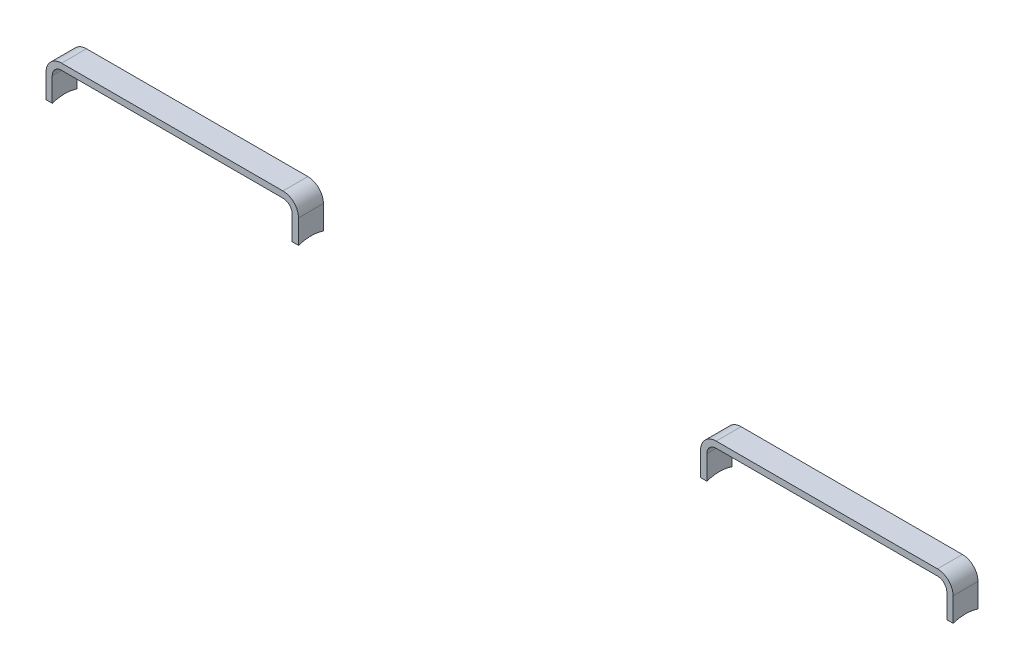
ISO-10303-21;
HEADER;
FILE_DESCRIPTION(('STEP AP214'),'2;1');
FILE_NAME('part.step','',(''),(''),'','','');
FILE_SCHEMA(('AUTOMOTIVE_DESIGN { 1 0 10303 214 1 1 1 1 }'));
ENDSEC;
DATA;
#1=APPLICATION_CONTEXT('core data for automotive mechanical design processes');
#2=APPLICATION_PROTOCOL_DEFINITION('international standard','automotive_design',2000,#1);
#3=PRODUCT_CONTEXT('',#1,'mechanical');
#4=PRODUCT('Part','Part','',(#3));
#5=PRODUCT_RELATED_PRODUCT_CATEGORY('part','',(#4));
#6=PRODUCT_DEFINITION_FORMATION('','',#4);
#7=PRODUCT_DEFINITION_CONTEXT('part definition',#1,'design');
#8=PRODUCT_DEFINITION('design','',#6,#7);
#9=PRODUCT_DEFINITION_SHAPE('','',#8);
#10=(LENGTH_UNIT() NAMED_UNIT(*) SI_UNIT(.MILLI.,.METRE.));
#11=(NAMED_UNIT(*) PLANE_ANGLE_UNIT() SI_UNIT($,.RADIAN.));
#12=(NAMED_UNIT(*) SI_UNIT($,.STERADIAN.) SOLID_ANGLE_UNIT());
#13=UNCERTAINTY_MEASURE_WITH_UNIT(LENGTH_MEASURE(1.E-05),#10,'distance_accuracy_value','');
#14=(GEOMETRIC_REPRESENTATION_CONTEXT(3) GLOBAL_UNCERTAINTY_ASSIGNED_CONTEXT((#13)) GLOBAL_UNIT_ASSIGNED_CONTEXT((#10,
#11,#12)) REPRESENTATION_CONTEXT('',''));
#15=CARTESIAN_POINT('',(0.,0.,0.));
#16=DIRECTION('',(0.,0.,1.));
#17=DIRECTION('',(1.,0.,0.));
#18=AXIS2_PLACEMENT_3D('',#15,#16,#17);
#19=CARTESIAN_POINT('',(140.5,649.700004626427,-1580.));
#20=DIRECTION('',(0.,0.,1.));
#21=DIRECTION('',(0.,-1.,0.));
#22=AXIS2_PLACEMENT_3D('',#19,#20,#21);
#23=CYLINDRICAL_SURFACE('',#22,5.);
#24=CARTESIAN_POINT('',(140.5,649.700004626427,-1576.));
#25=DIRECTION('',(0.,0.,-1.));
#26=DIRECTION('',(-1.,0.,0.));
#27=AXIS2_PLACEMENT_3D('',#24,#25,#26);
#28=CIRCLE('',#27,5.);
#29=CARTESIAN_POINT('',(140.5,654.700004626427,-1576.));
#30=VERTEX_POINT('',#29);
#31=CARTESIAN_POINT('',(145.5,649.700004626427,-1576.));
#32=VERTEX_POINT('',#31);
#33=EDGE_CURVE('E330',#30,#32,#28,.T.);
#34=ORIENTED_EDGE('',*,*,#33,.T.);
#35=DIRECTION('',(0.,0.,1.));
#36=VECTOR('',#35,1.);
#37=CARTESIAN_POINT('',(145.5,649.700004626427,-1580.));
#38=LINE('',#37,#36);
#39=CARTESIAN_POINT('',(145.5,649.700004626427,-1584.));
#40=VERTEX_POINT('',#39);
#41=EDGE_CURVE('E335',#40,#32,#38,.T.);
#42=ORIENTED_EDGE('',*,*,#41,.F.);
#43=CARTESIAN_POINT('',(140.5,649.700004626427,-1584.));
#44=DIRECTION('',(0.,0.,-1.));
#45=DIRECTION('',(-1.,0.,0.));
#46=AXIS2_PLACEMENT_3D('',#43,#44,#45);
#47=CIRCLE('',#46,5.);
#48=CARTESIAN_POINT('',(140.5,654.700004626427,-1584.));
#49=VERTEX_POINT('',#48);
#50=EDGE_CURVE('E275',#49,#40,#47,.T.);
#51=ORIENTED_EDGE('',*,*,#50,.F.);
#52=DIRECTION('',(0.,0.,1.));
#53=VECTOR('',#52,1.);
#54=CARTESIAN_POINT('',(140.5,654.700004626427,-1580.));
#55=LINE('',#54,#53);
#56=EDGE_CURVE('E272',#49,#30,#55,.T.);
#57=ORIENTED_EDGE('',*,*,#56,.T.);
#58=EDGE_LOOP('',(#34,#42,#51,#57));
#59=FACE_BOUND('',#58,.T.);
#60=ADVANCED_FACE('F142',(#59),#23,.T.);
#61=CARTESIAN_POINT('',(140.5,654.700004626427,-1580.));
#62=DIRECTION('',(0.,-1.,0.));
#63=DIRECTION('',(0.,0.,-1.));
#64=AXIS2_PLACEMENT_3D('',#61,#62,#63);
#65=PLANE('',#64);
#66=DIRECTION('',(-1.,0.,0.));
#67=VECTOR('',#66,1.);
#68=CARTESIAN_POINT('',(140.5,654.700004626427,-1576.));
#69=LINE('',#68,#67);
#70=CARTESIAN_POINT('',(69.5000000000004,654.700004626427,-1576.));
#71=VERTEX_POINT('',#70);
#72=EDGE_CURVE('E323',#30,#71,#69,.T.);
#73=ORIENTED_EDGE('',*,*,#72,.F.);
#74=ORIENTED_EDGE('',*,*,#56,.F.);
#75=DIRECTION('',(-1.,0.,0.));
#76=VECTOR('',#75,1.);
#77=CARTESIAN_POINT('',(140.5,654.700004626427,-1584.));
#78=LINE('',#77,#76);
#79=CARTESIAN_POINT('',(69.5000000000004,654.700004626427,-1584.));
#80=VERTEX_POINT('',#79);
#81=EDGE_CURVE('E268',#49,#80,#78,.T.);
#82=ORIENTED_EDGE('',*,*,#81,.T.);
#83=DIRECTION('',(0.,0.,1.));
#84=VECTOR('',#83,1.);
#85=CARTESIAN_POINT('',(69.5000000000004,654.700004626427,-1580.));
#86=LINE('',#85,#84);
#87=EDGE_CURVE('E271',#80,#71,#86,.T.);
#88=ORIENTED_EDGE('',*,*,#87,.T.);
#89=EDGE_LOOP('',(#73,#74,#82,#88));
#90=FACE_BOUND('',#89,.T.);
#91=ADVANCED_FACE('F388',(#90),#65,.F.);
#92=CARTESIAN_POINT('',(69.5000000000004,649.700004626427,-1580.));
#93=DIRECTION('',(0.,0.,1.));
#94=DIRECTION('',(0.,-1.,0.));
#95=AXIS2_PLACEMENT_3D('',#92,#93,#94);
#96=CYLINDRICAL_SURFACE('',#95,5.);
#97=CARTESIAN_POINT('',(69.5000000000004,649.700004626427,-1576.));
#98=DIRECTION('',(0.,0.,1.));
#99=DIRECTION('',(1.,0.,0.));
#100=AXIS2_PLACEMENT_3D('',#97,#98,#99);
#101=CIRCLE('',#100,5.);
#102=CARTESIAN_POINT('',(64.5000000000004,649.700004626427,-1576.));
#103=VERTEX_POINT('',#102);
#104=EDGE_CURVE('E326',#71,#103,#101,.T.);
#105=ORIENTED_EDGE('',*,*,#104,.F.);
#106=ORIENTED_EDGE('',*,*,#87,.F.);
#107=CARTESIAN_POINT('',(69.5000000000004,649.700004626427,-1584.));
#108=DIRECTION('',(0.,0.,1.));
#109=DIRECTION('',(1.,0.,0.));
#110=AXIS2_PLACEMENT_3D('',#107,#108,#109);
#111=CIRCLE('',#110,5.);
#112=CARTESIAN_POINT('',(64.5000000000004,649.700004626427,-1584.));
#113=VERTEX_POINT('',#112);
#114=EDGE_CURVE('E345',#80,#113,#111,.T.);
#115=ORIENTED_EDGE('',*,*,#114,.T.);
#116=DIRECTION('',(0.,0.,1.));
#117=VECTOR('',#116,1.);
#118=CARTESIAN_POINT('',(64.5000000000004,649.700004626427,-1580.));
#119=LINE('',#118,#117);
#120=EDGE_CURVE('E306',#113,#103,#119,.T.);
#121=ORIENTED_EDGE('',*,*,#120,.T.);
#122=EDGE_LOOP('',(#105,#106,#115,#121));
#123=FACE_BOUND('',#122,.T.);
#124=ADVANCED_FACE('F378',(#123),#96,.T.);
#125=CARTESIAN_POINT('',(69.5000000000004,649.700004626427,-1580.));
#126=DIRECTION('',(0.,0.,1.));
#127=DIRECTION('',(0.,-1.,0.));
#128=AXIS2_PLACEMENT_3D('',#125,#126,#127);
#129=CYLINDRICAL_SURFACE('',#128,3.);
#130=CARTESIAN_POINT('',(69.5000000000004,649.700004626427,-1576.));
#131=DIRECTION('',(0.,0.,1.));
#132=DIRECTION('',(1.,0.,0.));
#133=AXIS2_PLACEMENT_3D('',#130,#131,#132);
#134=CIRCLE('',#133,3.);
#135=CARTESIAN_POINT('',(69.5000000000004,652.700004626427,-1576.));
#136=VERTEX_POINT('',#135);
#137=CARTESIAN_POINT('',(66.5000000000004,649.700004626427,-1576.));
#138=VERTEX_POINT('',#137);
#139=EDGE_CURVE('E302',#136,#138,#134,.T.);
#140=ORIENTED_EDGE('',*,*,#139,.T.);
#141=DIRECTION('',(0.,0.,1.));
#142=VECTOR('',#141,1.);
#143=CARTESIAN_POINT('',(66.5000000000004,649.700004626427,-1580.));
#144=LINE('',#143,#142);
#145=CARTESIAN_POINT('',(66.5000000000004,649.700004626427,-1584.));
#146=VERTEX_POINT('',#145);
#147=EDGE_CURVE('E281',#146,#138,#144,.T.);
#148=ORIENTED_EDGE('',*,*,#147,.F.);
#149=CARTESIAN_POINT('',(69.5000000000004,649.700004626427,-1584.));
#150=DIRECTION('',(0.,0.,1.));
#151=DIRECTION('',(1.,0.,0.));
#152=AXIS2_PLACEMENT_3D('',#149,#150,#151);
#153=CIRCLE('',#152,3.);
#154=CARTESIAN_POINT('',(69.5000000000004,652.700004626427,-1584.));
#155=VERTEX_POINT('',#154);
#156=EDGE_CURVE('E393',#155,#146,#153,.T.);
#157=ORIENTED_EDGE('',*,*,#156,.F.);
#158=DIRECTION('',(0.,0.,1.));
#159=VECTOR('',#158,1.);
#160=CARTESIAN_POINT('',(69.5000000000004,652.700004626427,-1580.));
#161=LINE('',#160,#159);
#162=EDGE_CURVE('E305',#155,#136,#161,.T.);
#163=ORIENTED_EDGE('',*,*,#162,.T.);
#164=EDGE_LOOP('',(#140,#148,#157,#163));
#165=FACE_BOUND('',#164,.T.);
#166=ADVANCED_FACE('F406',(#165),#129,.F.);
#167=CARTESIAN_POINT('',(140.5,652.700004626427,-1580.));
#168=DIRECTION('',(0.,-1.,0.));
#169=DIRECTION('',(0.,0.,-1.));
#170=AXIS2_PLACEMENT_3D('',#167,#168,#169);
#171=PLANE('',#170);
#172=DIRECTION('',(-1.,0.,0.));
#173=VECTOR('',#172,1.);
#174=CARTESIAN_POINT('',(140.5,652.700004626427,-1576.));
#175=LINE('',#174,#173);
#176=CARTESIAN_POINT('',(140.5,652.700004626427,-1576.));
#177=VERTEX_POINT('',#176);
#178=EDGE_CURVE('E260',#177,#136,#175,.T.);
#179=ORIENTED_EDGE('',*,*,#178,.T.);
#180=ORIENTED_EDGE('',*,*,#162,.F.);
#181=DIRECTION('',(-1.,0.,0.));
#182=VECTOR('',#181,1.);
#183=CARTESIAN_POINT('',(140.5,652.700004626427,-1584.));
#184=LINE('',#183,#182);
#185=CARTESIAN_POINT('',(140.5,652.700004626427,-1584.));
#186=VERTEX_POINT('',#185);
#187=EDGE_CURVE('E246',#186,#155,#184,.T.);
#188=ORIENTED_EDGE('',*,*,#187,.F.);
#189=DIRECTION('',(0.,0.,1.));
#190=VECTOR('',#189,1.);
#191=CARTESIAN_POINT('',(140.5,652.700004626427,-1580.));
#192=LINE('',#191,#190);
#193=EDGE_CURVE('E258',#186,#177,#192,.T.);
#194=ORIENTED_EDGE('',*,*,#193,.T.);
#195=EDGE_LOOP('',(#179,#180,#188,#194));
#196=FACE_BOUND('',#195,.T.);
#197=ADVANCED_FACE('F402',(#196),#171,.T.);
#198=CARTESIAN_POINT('',(140.5,649.700004626427,-1580.));
#199=DIRECTION('',(0.,0.,1.));
#200=DIRECTION('',(0.,-1.,0.));
#201=AXIS2_PLACEMENT_3D('',#198,#199,#200);
#202=CYLINDRICAL_SURFACE('',#201,3.);
#203=CARTESIAN_POINT('',(140.5,649.700004626427,-1576.));
#204=DIRECTION('',(0.,0.,-1.));
#205=DIRECTION('',(-1.,0.,0.));
#206=AXIS2_PLACEMENT_3D('',#203,#204,#205);
#207=CIRCLE('',#206,3.);
#208=CARTESIAN_POINT('',(143.5,649.700004626427,-1576.));
#209=VERTEX_POINT('',#208);
#210=EDGE_CURVE('E284',#177,#209,#207,.T.);
#211=ORIENTED_EDGE('',*,*,#210,.F.);
#212=ORIENTED_EDGE('',*,*,#193,.F.);
#213=CARTESIAN_POINT('',(140.5,649.700004626427,-1584.));
#214=DIRECTION('',(0.,0.,-1.));
#215=DIRECTION('',(-1.,0.,0.));
#216=AXIS2_PLACEMENT_3D('',#213,#214,#215);
#217=CIRCLE('',#216,3.);
#218=CARTESIAN_POINT('',(143.5,649.700004626427,-1584.));
#219=VERTEX_POINT('',#218);
#220=EDGE_CURVE('E241',#186,#219,#217,.T.);
#221=ORIENTED_EDGE('',*,*,#220,.T.);
#222=DIRECTION('',(0.,0.,1.));
#223=VECTOR('',#222,1.);
#224=CARTESIAN_POINT('',(143.5,649.700004626427,-1580.));
#225=LINE('',#224,#223);
#226=EDGE_CURVE('E249',#219,#209,#225,.T.);
#227=ORIENTED_EDGE('',*,*,#226,.T.);
#228=EDGE_LOOP('',(#211,#212,#221,#227));
#229=FACE_BOUND('',#228,.T.);
#230=ADVANCED_FACE('F257',(#229),#202,.F.);
#231=CARTESIAN_POINT('',(0.,-4.96702508494515E-10,-1583.9999999998));
#232=DIRECTION('',(0.,-3.14370920745357E-13,-1.));
#233=DIRECTION('',(0.,1.,-3.14370920745357E-13));
#234=AXIS2_PLACEMENT_3D('',#231,#232,#233);
#235=PLANE('',#234);
#236=DIRECTION('',(0.,1.,0.));
#237=VECTOR('',#236,1.);
#238=CARTESIAN_POINT('',(145.5,630.000004626427,-1584.));
#239=LINE('',#238,#237);
#240=CARTESIAN_POINT('',(145.5,642.053634785014,-1584.));
#241=VERTEX_POINT('',#240);
#242=EDGE_CURVE('E339',#241,#40,#239,.T.);
#243=ORIENTED_EDGE('',*,*,#242,.F.);
#244=DIRECTION('',(-1.,0.,0.));
#245=VECTOR('',#244,1.);
#246=CARTESIAN_POINT('',(200.,642.053634785014,-1584.));
#247=LINE('',#246,#245);
#248=CARTESIAN_POINT('',(143.5,642.053634785014,-1584.));
#249=VERTEX_POINT('',#248);
#250=EDGE_CURVE('E243',#241,#249,#247,.T.);
#251=ORIENTED_EDGE('',*,*,#250,.T.);
#252=DIRECTION('',(0.,1.,0.));
#253=VECTOR('',#252,1.);
#254=CARTESIAN_POINT('',(143.5,630.000004626427,-1584.));
#255=LINE('',#254,#253);
#256=EDGE_CURVE('E235',#249,#219,#255,.T.);
#257=ORIENTED_EDGE('',*,*,#256,.T.);
#258=ORIENTED_EDGE('',*,*,#220,.F.);
#259=ORIENTED_EDGE('',*,*,#187,.T.);
#260=ORIENTED_EDGE('',*,*,#156,.T.);
#261=DIRECTION('',(0.,-1.,0.));
#262=VECTOR('',#261,1.);
#263=CARTESIAN_POINT('',(66.5000000000004,649.700004626427,-1584.));
#264=LINE('',#263,#262);
#265=CARTESIAN_POINT('',(66.5000000000003,642.053634785014,-1584.));
#266=VERTEX_POINT('',#265);
#267=EDGE_CURVE('E351',#146,#266,#264,.T.);
#268=ORIENTED_EDGE('',*,*,#267,.T.);
#269=CARTESIAN_POINT('',(64.5000000000003,642.053634785014,-1584.));
#270=VERTEX_POINT('',#269);
#271=EDGE_CURVE('E182',#266,#270,#247,.T.);
#272=ORIENTED_EDGE('',*,*,#271,.T.);
#273=DIRECTION('',(0.,-1.,0.));
#274=VECTOR('',#273,1.);
#275=CARTESIAN_POINT('',(64.5000000000004,649.700004626427,-1584.));
#276=LINE('',#275,#274);
#277=EDGE_CURVE('E338',#113,#270,#276,.T.);
#278=ORIENTED_EDGE('',*,*,#277,.F.);
#279=ORIENTED_EDGE('',*,*,#114,.F.);
#280=ORIENTED_EDGE('',*,*,#81,.F.);
#281=ORIENTED_EDGE('',*,*,#50,.T.);
#282=EDGE_LOOP('',(#243,#251,#257,#258,#259,#260,#268,#272,#278,#279,#280,#281));
#283=FACE_BOUND('',#282,.T.);
#284=ADVANCED_FACE('F238',(#283),#235,.T.);
#285=CARTESIAN_POINT('',(66.5000000000004,649.700004626427,-1580.));
#286=DIRECTION('',(1.,0.,0.));
#287=DIRECTION('',(0.,0.,1.));
#288=AXIS2_PLACEMENT_3D('',#285,#286,#287);
#289=PLANE('',#288);
#290=DIRECTION('',(0.,-1.,0.));
#291=VECTOR('',#290,1.);
#292=CARTESIAN_POINT('',(66.5000000000004,649.700004626427,-1576.));
#293=LINE('',#292,#291);
#294=CARTESIAN_POINT('',(66.5000000000003,642.053634785014,-1576.));
#295=VERTEX_POINT('',#294);
#296=EDGE_CURVE('E277',#138,#295,#293,.T.);
#297=ORIENTED_EDGE('',*,*,#296,.T.);
#298=CARTESIAN_POINT('',(66.5000000000003,630.000004626427,-1580.));
#299=DIRECTION('',(1.,0.,0.));
#300=DIRECTION('',(0.,0.,-1.));
#301=AXIS2_PLACEMENT_3D('',#298,#299,#300);
#302=CIRCLE('',#301,12.7);
#303=EDGE_CURVE('E178',#295,#266,#302,.F.);
#304=ORIENTED_EDGE('',*,*,#303,.T.);
#305=ORIENTED_EDGE('',*,*,#267,.F.);
#306=ORIENTED_EDGE('',*,*,#147,.T.);
#307=EDGE_LOOP('',(#297,#304,#305,#306));
#308=FACE_BOUND('',#307,.T.);
#309=ADVANCED_FACE('F408',(#308),#289,.T.);
#310=CARTESIAN_POINT('',(143.5,630.000004626427,-1580.));
#311=DIRECTION('',(-1.,0.,0.));
#312=DIRECTION('',(0.,0.,-1.));
#313=AXIS2_PLACEMENT_3D('',#310,#311,#312);
#314=PLANE('',#313);
#315=ORIENTED_EDGE('',*,*,#256,.F.);
#316=CARTESIAN_POINT('',(143.5,630.000004626427,-1580.));
#317=DIRECTION('',(-1.,0.,0.));
#318=DIRECTION('',(0.,0.,1.));
#319=AXIS2_PLACEMENT_3D('',#316,#317,#318);
#320=CIRCLE('',#319,12.7);
#321=CARTESIAN_POINT('',(143.5,642.053634785014,-1576.));
#322=VERTEX_POINT('',#321);
#323=EDGE_CURVE('E279',#249,#322,#320,.F.);
#324=ORIENTED_EDGE('',*,*,#323,.T.);
#325=DIRECTION('',(0.,1.,0.));
#326=VECTOR('',#325,1.);
#327=CARTESIAN_POINT('',(143.5,630.000004626427,-1576.));
#328=LINE('',#327,#326);
#329=EDGE_CURVE('E252',#322,#209,#328,.T.);
#330=ORIENTED_EDGE('',*,*,#329,.T.);
#331=ORIENTED_EDGE('',*,*,#226,.F.);
#332=EDGE_LOOP('',(#315,#324,#330,#331));
#333=FACE_BOUND('',#332,.T.);
#334=ADVANCED_FACE('F250',(#333),#314,.T.);
#335=CARTESIAN_POINT('',(145.5,630.000004626427,-1580.));
#336=DIRECTION('',(-1.,0.,0.));
#337=DIRECTION('',(0.,0.,-1.));
#338=AXIS2_PLACEMENT_3D('',#335,#336,#337);
#339=PLANE('',#338);
#340=CARTESIAN_POINT('',(145.5,630.000004626427,-1580.));
#341=DIRECTION('',(-1.,0.,0.));
#342=DIRECTION('',(0.,0.,1.));
#343=AXIS2_PLACEMENT_3D('',#340,#341,#342);
#344=CIRCLE('',#343,12.7);
#345=CARTESIAN_POINT('',(145.5,642.053634785014,-1576.));
#346=VERTEX_POINT('',#345);
#347=EDGE_CURVE('E13',#241,#346,#344,.F.);
#348=ORIENTED_EDGE('',*,*,#347,.F.);
#349=ORIENTED_EDGE('',*,*,#242,.T.);
#350=ORIENTED_EDGE('',*,*,#41,.T.);
#351=DIRECTION('',(0.,1.,0.));
#352=VECTOR('',#351,1.);
#353=CARTESIAN_POINT('',(145.5,630.000004626427,-1576.));
#354=LINE('',#353,#352);
#355=EDGE_CURVE('E327',#346,#32,#354,.T.);
#356=ORIENTED_EDGE('',*,*,#355,.F.);
#357=EDGE_LOOP('',(#348,#349,#350,#356));
#358=FACE_BOUND('',#357,.T.);
#359=ADVANCED_FACE('F426',(#358),#339,.F.);
#360=CARTESIAN_POINT('',(64.5000000000004,649.700004626427,-1580.));
#361=DIRECTION('',(1.,0.,0.));
#362=DIRECTION('',(0.,0.,1.));
#363=AXIS2_PLACEMENT_3D('',#360,#361,#362);
#364=PLANE('',#363);
#365=CARTESIAN_POINT('',(64.5000000000003,630.000004626427,-1580.));
#366=DIRECTION('',(1.,0.,0.));
#367=DIRECTION('',(0.,0.,-1.));
#368=AXIS2_PLACEMENT_3D('',#365,#366,#367);
#369=CIRCLE('',#368,12.7);
#370=CARTESIAN_POINT('',(64.5000000000003,642.053634785014,-1576.));
#371=VERTEX_POINT('',#370);
#372=EDGE_CURVE('E185',#371,#270,#369,.F.);
#373=ORIENTED_EDGE('',*,*,#372,.F.);
#374=DIRECTION('',(0.,-1.,0.));
#375=VECTOR('',#374,1.);
#376=CARTESIAN_POINT('',(64.5000000000004,649.700004626427,-1576.));
#377=LINE('',#376,#375);
#378=EDGE_CURVE('E295',#103,#371,#377,.T.);
#379=ORIENTED_EDGE('',*,*,#378,.F.);
#380=ORIENTED_EDGE('',*,*,#120,.F.);
#381=ORIENTED_EDGE('',*,*,#277,.T.);
#382=EDGE_LOOP('',(#373,#379,#380,#381));
#383=FACE_BOUND('',#382,.T.);
#384=ADVANCED_FACE('F382',(#383),#364,.F.);
#385=CARTESIAN_POINT('',(0.,-4.96709601060686E-10,-1575.9999999998));
#386=DIRECTION('',(0.,-3.14370920745357E-13,-1.));
#387=DIRECTION('',(0.,1.,-3.14370920745357E-13));
#388=AXIS2_PLACEMENT_3D('',#385,#386,#387);
#389=PLANE('',#388);
#390=DIRECTION('',(-1.,0.,0.));
#391=VECTOR('',#390,1.);
#392=CARTESIAN_POINT('',(200.,642.053634785014,-1576.));
#393=LINE('',#392,#391);
#394=EDGE_CURVE('E152',#346,#322,#393,.T.);
#395=ORIENTED_EDGE('',*,*,#394,.F.);
#396=ORIENTED_EDGE('',*,*,#355,.T.);
#397=ORIENTED_EDGE('',*,*,#33,.F.);
#398=ORIENTED_EDGE('',*,*,#72,.T.);
#399=ORIENTED_EDGE('',*,*,#104,.T.);
#400=ORIENTED_EDGE('',*,*,#378,.T.);
#401=EDGE_CURVE('E282',#295,#371,#393,.T.);
#402=ORIENTED_EDGE('',*,*,#401,.F.);
#403=ORIENTED_EDGE('',*,*,#296,.F.);
#404=ORIENTED_EDGE('',*,*,#139,.F.);
#405=ORIENTED_EDGE('',*,*,#178,.F.);
#406=ORIENTED_EDGE('',*,*,#210,.T.);
#407=ORIENTED_EDGE('',*,*,#329,.F.);
#408=EDGE_LOOP('',(#395,#396,#397,#398,#399,#400,#402,#403,#404,#405,#406,#407));
#409=FACE_BOUND('',#408,.T.);
#410=ADVANCED_FACE('F144',(#409),#389,.F.);
#411=CARTESIAN_POINT('',(200.,630.000004626427,-1580.));
#412=DIRECTION('',(-1.,0.,0.));
#413=DIRECTION('',(0.,0.,1.));
#414=AXIS2_PLACEMENT_3D('',#411,#412,#413);
#415=CYLINDRICAL_SURFACE('',#414,12.7);
#416=ORIENTED_EDGE('',*,*,#401,.T.);
#417=ORIENTED_EDGE('',*,*,#372,.T.);
#418=ORIENTED_EDGE('',*,*,#271,.F.);
#419=ORIENTED_EDGE('',*,*,#303,.F.);
#420=EDGE_LOOP('',(#416,#417,#418,#419));
#421=FACE_BOUND('',#420,.T.);
#422=ADVANCED_FACE('F409',(#421),#415,.F.);
#423=ORIENTED_EDGE('',*,*,#394,.T.);
#424=ORIENTED_EDGE('',*,*,#323,.F.);
#425=ORIENTED_EDGE('',*,*,#250,.F.);
#426=ORIENTED_EDGE('',*,*,#347,.T.);
#427=EDGE_LOOP('',(#423,#424,#425,#426));
#428=FACE_BOUND('',#427,.T.);
#429=ADVANCED_FACE('F411',(#428),#415,.F.);
#430=CLOSED_SHELL('',(#60,#91,#124,#166,#197,#230,#284,#309,#334,#359,#384,#410,#422,#429));
#431=MANIFOLD_SOLID_BREP('B2',#430);
#432=CARTESIAN_POINT('',(-69.5000000000004,649.700004626427,-1580.));
#433=DIRECTION('',(0.,0.,1.));
#434=DIRECTION('',(0.,-1.,0.));
#435=AXIS2_PLACEMENT_3D('',#432,#433,#434);
#436=CYLINDRICAL_SURFACE('',#435,5.);
#437=CARTESIAN_POINT('',(-69.5000000000004,649.700004626427,-1576.));
#438=DIRECTION('',(0.,0.,-1.));
#439=DIRECTION('',(-1.,0.,0.));
#440=AXIS2_PLACEMENT_3D('',#437,#438,#439);
#441=CIRCLE('',#440,5.);
#442=CARTESIAN_POINT('',(-69.5000000000004,654.700004626427,-1576.));
#443=VERTEX_POINT('',#442);
#444=CARTESIAN_POINT('',(-64.5000000000004,649.700004626427,-1576.));
#445=VERTEX_POINT('',#444);
#446=EDGE_CURVE('E698',#443,#445,#441,.T.);
#447=ORIENTED_EDGE('',*,*,#446,.T.);
#448=DIRECTION('',(0.,0.,1.));
#449=VECTOR('',#448,1.);
#450=CARTESIAN_POINT('',(-64.5000000000004,649.700004626427,-1580.));
#451=LINE('',#450,#449);
#452=CARTESIAN_POINT('',(-64.5000000000004,649.700004626427,-1584.));
#453=VERTEX_POINT('',#452);
#454=EDGE_CURVE('E684',#453,#445,#451,.T.);
#455=ORIENTED_EDGE('',*,*,#454,.F.);
#456=CARTESIAN_POINT('',(-69.5000000000004,649.700004626427,-1584.));
#457=DIRECTION('',(0.,0.,-1.));
#458=DIRECTION('',(-1.,0.,0.));
#459=AXIS2_PLACEMENT_3D('',#456,#457,#458);
#460=CIRCLE('',#459,5.);
#461=CARTESIAN_POINT('',(-69.5000000000004,654.700004626427,-1584.));
#462=VERTEX_POINT('',#461);
#463=EDGE_CURVE('E662',#462,#453,#460,.T.);
#464=ORIENTED_EDGE('',*,*,#463,.F.);
#465=DIRECTION('',(0.,0.,1.));
#466=VECTOR('',#465,1.);
#467=CARTESIAN_POINT('',(-69.5000000000004,654.700004626427,-1580.));
#468=LINE('',#467,#466);
#469=EDGE_CURVE('E694',#462,#443,#468,.T.);
#470=ORIENTED_EDGE('',*,*,#469,.T.);
#471=EDGE_LOOP('',(#447,#455,#464,#470));
#472=FACE_BOUND('',#471,.T.);
#473=ADVANCED_FACE('F531',(#472),#436,.T.);
#474=CARTESIAN_POINT('',(-140.5,654.700004626427,-1580.));
#475=DIRECTION('',(0.,-1.,0.));
#476=DIRECTION('',(0.,0.,-1.));
#477=AXIS2_PLACEMENT_3D('',#474,#475,#476);
#478=PLANE('',#477);
#479=DIRECTION('',(1.,0.,0.));
#480=VECTOR('',#479,1.);
#481=CARTESIAN_POINT('',(-140.5,654.700004626427,-1576.));
#482=LINE('',#481,#480);
#483=CARTESIAN_POINT('',(-140.5,654.700004626427,-1576.));
#484=VERTEX_POINT('',#483);
#485=EDGE_CURVE('E697',#484,#443,#482,.T.);
#486=ORIENTED_EDGE('',*,*,#485,.T.);
#487=ORIENTED_EDGE('',*,*,#469,.F.);
#488=DIRECTION('',(1.,0.,0.));
#489=VECTOR('',#488,1.);
#490=CARTESIAN_POINT('',(-140.5,654.700004626427,-1584.));
#491=LINE('',#490,#489);
#492=CARTESIAN_POINT('',(-140.5,654.700004626427,-1584.));
#493=VERTEX_POINT('',#492);
#494=EDGE_CURVE('E659',#493,#462,#491,.T.);
#495=ORIENTED_EDGE('',*,*,#494,.F.);
#496=DIRECTION('',(0.,0.,1.));
#497=VECTOR('',#496,1.);
#498=CARTESIAN_POINT('',(-140.5,654.700004626427,-1580.));
#499=LINE('',#498,#497);
#500=EDGE_CURVE('E668',#493,#484,#499,.T.);
#501=ORIENTED_EDGE('',*,*,#500,.T.);
#502=EDGE_LOOP('',(#486,#487,#495,#501));
#503=FACE_BOUND('',#502,.T.);
#504=ADVANCED_FACE('F789',(#503),#478,.F.);
#505=CARTESIAN_POINT('',(-140.5,649.700004626427,-1580.));
#506=DIRECTION('',(0.,0.,1.));
#507=DIRECTION('',(0.,-1.,0.));
#508=AXIS2_PLACEMENT_3D('',#505,#506,#507);
#509=CYLINDRICAL_SURFACE('',#508,5.);
#510=CARTESIAN_POINT('',(-140.5,649.700004626427,-1576.));
#511=DIRECTION('',(0.,0.,1.));
#512=DIRECTION('',(1.,0.,0.));
#513=AXIS2_PLACEMENT_3D('',#510,#511,#512);
#514=CIRCLE('',#513,5.);
#515=CARTESIAN_POINT('',(-145.5,649.700004626427,-1576.));
#516=VERTEX_POINT('',#515);
#517=EDGE_CURVE('E687',#484,#516,#514,.T.);
#518=ORIENTED_EDGE('',*,*,#517,.F.);
#519=ORIENTED_EDGE('',*,*,#500,.F.);
#520=CARTESIAN_POINT('',(-140.5,649.700004626427,-1584.));
#521=DIRECTION('',(0.,0.,1.));
#522=DIRECTION('',(1.,0.,0.));
#523=AXIS2_PLACEMENT_3D('',#520,#521,#522);
#524=CIRCLE('',#523,5.);
#525=CARTESIAN_POINT('',(-145.5,649.700004626427,-1584.));
#526=VERTEX_POINT('',#525);
#527=EDGE_CURVE('E665',#493,#526,#524,.T.);
#528=ORIENTED_EDGE('',*,*,#527,.T.);
#529=DIRECTION('',(0.,0.,1.));
#530=VECTOR('',#529,1.);
#531=CARTESIAN_POINT('',(-145.5,649.700004626427,-1580.));
#532=LINE('',#531,#530);
#533=EDGE_CURVE('E667',#526,#516,#532,.T.);
#534=ORIENTED_EDGE('',*,*,#533,.T.);
#535=EDGE_LOOP('',(#518,#519,#528,#534));
#536=FACE_BOUND('',#535,.T.);
#537=ADVANCED_FACE('F816',(#536),#509,.T.);
#538=CARTESIAN_POINT('',(-140.5,649.700004626427,-1580.));
#539=DIRECTION('',(0.,0.,1.));
#540=DIRECTION('',(0.,-1.,0.));
#541=AXIS2_PLACEMENT_3D('',#538,#539,#540);
#542=CYLINDRICAL_SURFACE('',#541,3.);
#543=CARTESIAN_POINT('',(-140.5,649.700004626427,-1576.));
#544=DIRECTION('',(0.,0.,1.));
#545=DIRECTION('',(1.,0.,0.));
#546=AXIS2_PLACEMENT_3D('',#543,#544,#545);
#547=CIRCLE('',#546,3.);
#548=CARTESIAN_POINT('',(-140.5,652.700004626427,-1576.));
#549=VERTEX_POINT('',#548);
#550=CARTESIAN_POINT('',(-143.5,649.700004626427,-1576.));
#551=VERTEX_POINT('',#550);
#552=EDGE_CURVE('E638',#549,#551,#547,.T.);
#553=ORIENTED_EDGE('',*,*,#552,.T.);
#554=DIRECTION('',(0.,0.,1.));
#555=VECTOR('',#554,1.);
#556=CARTESIAN_POINT('',(-143.5,649.700004626427,-1580.));
#557=LINE('',#556,#555);
#558=CARTESIAN_POINT('',(-143.5,649.700004626427,-1584.));
#559=VERTEX_POINT('',#558);
#560=EDGE_CURVE('E627',#559,#551,#557,.T.);
#561=ORIENTED_EDGE('',*,*,#560,.F.);
#562=CARTESIAN_POINT('',(-140.5,649.700004626427,-1584.));
#563=DIRECTION('',(0.,0.,1.));
#564=DIRECTION('',(1.,0.,0.));
#565=AXIS2_PLACEMENT_3D('',#562,#563,#564);
#566=CIRCLE('',#565,3.);
#567=CARTESIAN_POINT('',(-140.5,652.700004626427,-1584.));
#568=VERTEX_POINT('',#567);
#569=EDGE_CURVE('E636',#568,#559,#566,.T.);
#570=ORIENTED_EDGE('',*,*,#569,.F.);
#571=DIRECTION('',(0.,0.,1.));
#572=VECTOR('',#571,1.);
#573=CARTESIAN_POINT('',(-140.5,652.700004626427,-1580.));
#574=LINE('',#573,#572);
#575=EDGE_CURVE('E737',#568,#549,#574,.T.);
#576=ORIENTED_EDGE('',*,*,#575,.T.);
#577=EDGE_LOOP('',(#553,#561,#570,#576));
#578=FACE_BOUND('',#577,.T.);
#579=ADVANCED_FACE('F634',(#578),#542,.F.);
#580=CARTESIAN_POINT('',(-140.5,652.700004626427,-1580.));
#581=DIRECTION('',(0.,-1.,0.));
#582=DIRECTION('',(0.,0.,-1.));
#583=AXIS2_PLACEMENT_3D('',#580,#581,#582);
#584=PLANE('',#583);
#585=DIRECTION('',(1.,0.,0.));
#586=VECTOR('',#585,1.);
#587=CARTESIAN_POINT('',(-140.5,652.700004626427,-1576.));
#588=LINE('',#587,#586);
#589=CARTESIAN_POINT('',(-69.5000000000004,652.700004626427,-1576.));
#590=VERTEX_POINT('',#589);
#591=EDGE_CURVE('E686',#549,#590,#588,.T.);
#592=ORIENTED_EDGE('',*,*,#591,.F.);
#593=ORIENTED_EDGE('',*,*,#575,.F.);
#594=DIRECTION('',(1.,0.,0.));
#595=VECTOR('',#594,1.);
#596=CARTESIAN_POINT('',(-140.5,652.700004626427,-1584.));
#597=LINE('',#596,#595);
#598=CARTESIAN_POINT('',(-69.5000000000004,652.700004626427,-1584.));
#599=VERTEX_POINT('',#598);
#600=EDGE_CURVE('E646',#568,#599,#597,.T.);
#601=ORIENTED_EDGE('',*,*,#600,.T.);
#602=DIRECTION('',(0.,0.,1.));
#603=VECTOR('',#602,1.);
#604=CARTESIAN_POINT('',(-69.5000000000004,652.700004626427,-1580.));
#605=LINE('',#604,#603);
#606=EDGE_CURVE('E728',#599,#590,#605,.T.);
#607=ORIENTED_EDGE('',*,*,#606,.T.);
#608=EDGE_LOOP('',(#592,#593,#601,#607));
#609=FACE_BOUND('',#608,.T.);
#610=ADVANCED_FACE('F776',(#609),#584,.T.);
#611=CARTESIAN_POINT('',(-69.5000000000004,649.700004626427,-1580.));
#612=DIRECTION('',(0.,0.,1.));
#613=DIRECTION('',(0.,-1.,0.));
#614=AXIS2_PLACEMENT_3D('',#611,#612,#613);
#615=CYLINDRICAL_SURFACE('',#614,3.);
#616=CARTESIAN_POINT('',(-69.5000000000004,649.700004626427,-1576.));
#617=DIRECTION('',(0.,0.,-1.));
#618=DIRECTION('',(-1.,0.,0.));
#619=AXIS2_PLACEMENT_3D('',#616,#617,#618);
#620=CIRCLE('',#619,3.);
#621=CARTESIAN_POINT('',(-66.5000000000004,649.700004626427,-1576.));
#622=VERTEX_POINT('',#621);
#623=EDGE_CURVE('E715',#590,#622,#620,.T.);
#624=ORIENTED_EDGE('',*,*,#623,.F.);
#625=ORIENTED_EDGE('',*,*,#606,.F.);
#626=CARTESIAN_POINT('',(-69.5000000000004,649.700004626427,-1584.));
#627=DIRECTION('',(0.,0.,-1.));
#628=DIRECTION('',(-1.,0.,0.));
#629=AXIS2_PLACEMENT_3D('',#626,#627,#628);
#630=CIRCLE('',#629,3.);
#631=CARTESIAN_POINT('',(-66.5000000000004,649.700004626427,-1584.));
#632=VERTEX_POINT('',#631);
#633=EDGE_CURVE('E721',#599,#632,#630,.T.);
#634=ORIENTED_EDGE('',*,*,#633,.T.);
#635=DIRECTION('',(0.,0.,1.));
#636=VECTOR('',#635,1.);
#637=CARTESIAN_POINT('',(-66.5000000000004,649.700004626427,-1580.));
#638=LINE('',#637,#636);
#639=EDGE_CURVE('E718',#632,#622,#638,.T.);
#640=ORIENTED_EDGE('',*,*,#639,.T.);
#641=EDGE_LOOP('',(#624,#625,#634,#640));
#642=FACE_BOUND('',#641,.T.);
#643=ADVANCED_FACE('F801',(#642),#615,.F.);
#644=CARTESIAN_POINT('',(0.,-4.96702508494515E-10,-1583.9999999998));
#645=DIRECTION('',(0.,-3.14370920745357E-13,-1.));
#646=DIRECTION('',(0.,1.,-3.14370920745357E-13));
#647=AXIS2_PLACEMENT_3D('',#644,#645,#646);
#648=PLANE('',#647);
#649=DIRECTION('',(0.,-1.,0.));
#650=VECTOR('',#649,1.);
#651=CARTESIAN_POINT('',(-64.5000000000004,649.700004626427,-1584.));
#652=LINE('',#651,#650);
#653=CARTESIAN_POINT('',(-64.5000000000003,642.053634785014,-1584.));
#654=VERTEX_POINT('',#653);
#655=EDGE_CURVE('E652',#453,#654,#652,.T.);
#656=ORIENTED_EDGE('',*,*,#655,.T.);
#657=DIRECTION('',(-1.,0.,0.));
#658=VECTOR('',#657,1.);
#659=CARTESIAN_POINT('',(200.,642.053634785014,-1584.));
#660=LINE('',#659,#658);
#661=CARTESIAN_POINT('',(-66.5000000000003,642.053634785014,-1584.));
#662=VERTEX_POINT('',#661);
#663=EDGE_CURVE('E647',#654,#662,#660,.T.);
#664=ORIENTED_EDGE('',*,*,#663,.T.);
#665=DIRECTION('',(0.,-1.,0.));
#666=VECTOR('',#665,1.);
#667=CARTESIAN_POINT('',(-66.5000000000004,649.700004626427,-1584.));
#668=LINE('',#667,#666);
#669=EDGE_CURVE('E673',#632,#662,#668,.T.);
#670=ORIENTED_EDGE('',*,*,#669,.F.);
#671=ORIENTED_EDGE('',*,*,#633,.F.);
#672=ORIENTED_EDGE('',*,*,#600,.F.);
#673=ORIENTED_EDGE('',*,*,#569,.T.);
#674=DIRECTION('',(0.,1.,0.));
#675=VECTOR('',#674,1.);
#676=CARTESIAN_POINT('',(-143.5,630.000004626427,-1584.));
#677=LINE('',#676,#675);
#678=CARTESIAN_POINT('',(-143.5,642.053634785014,-1584.));
#679=VERTEX_POINT('',#678);
#680=EDGE_CURVE('E623',#679,#559,#677,.T.);
#681=ORIENTED_EDGE('',*,*,#680,.F.);
#682=CARTESIAN_POINT('',(-145.5,642.053634785014,-1584.));
#683=VERTEX_POINT('',#682);
#684=EDGE_CURVE('E571',#679,#683,#660,.T.);
#685=ORIENTED_EDGE('',*,*,#684,.T.);
#686=DIRECTION('',(0.,1.,0.));
#687=VECTOR('',#686,1.);
#688=CARTESIAN_POINT('',(-145.5,630.000004626427,-1584.));
#689=LINE('',#688,#687);
#690=EDGE_CURVE('E649',#683,#526,#689,.T.);
#691=ORIENTED_EDGE('',*,*,#690,.T.);
#692=ORIENTED_EDGE('',*,*,#527,.F.);
#693=ORIENTED_EDGE('',*,*,#494,.T.);
#694=ORIENTED_EDGE('',*,*,#463,.T.);
#695=EDGE_LOOP('',(#656,#664,#670,#671,#672,#673,#681,#685,#691,#692,#693,#694));
#696=FACE_BOUND('',#695,.T.);
#697=ADVANCED_FACE('F643',(#696),#648,.T.);
#698=CARTESIAN_POINT('',(-66.5000000000004,649.700004626427,-1580.));
#699=DIRECTION('',(-1.,0.,0.));
#700=DIRECTION('',(0.,0.,1.));
#701=AXIS2_PLACEMENT_3D('',#698,#699,#700);
#702=PLANE('',#701);
#703=ORIENTED_EDGE('',*,*,#669,.T.);
#704=CARTESIAN_POINT('',(-66.5000000000003,630.000004626427,-1580.));
#705=DIRECTION('',(-1.,0.,0.));
#706=DIRECTION('',(0.,0.,1.));
#707=AXIS2_PLACEMENT_3D('',#704,#705,#706);
#708=CIRCLE('',#707,12.7);
#709=CARTESIAN_POINT('',(-66.5000000000003,642.053634785014,-1576.));
#710=VERTEX_POINT('',#709);
#711=EDGE_CURVE('E670',#662,#710,#708,.F.);
#712=ORIENTED_EDGE('',*,*,#711,.T.);
#713=DIRECTION('',(0.,-1.,0.));
#714=VECTOR('',#713,1.);
#715=CARTESIAN_POINT('',(-66.5000000000004,649.700004626427,-1576.));
#716=LINE('',#715,#714);
#717=EDGE_CURVE('E676',#622,#710,#716,.T.);
#718=ORIENTED_EDGE('',*,*,#717,.F.);
#719=ORIENTED_EDGE('',*,*,#639,.F.);
#720=EDGE_LOOP('',(#703,#712,#718,#719));
#721=FACE_BOUND('',#720,.T.);
#722=ADVANCED_FACE('F799',(#721),#702,.T.);
#723=CARTESIAN_POINT('',(-143.5,630.000004626427,-1580.));
#724=DIRECTION('',(1.,0.,0.));
#725=DIRECTION('',(0.,0.,-1.));
#726=AXIS2_PLACEMENT_3D('',#723,#724,#725);
#727=PLANE('',#726);
#728=DIRECTION('',(0.,1.,0.));
#729=VECTOR('',#728,1.);
#730=CARTESIAN_POINT('',(-143.5,630.000004626427,-1576.));
#731=LINE('',#730,#729);
#732=CARTESIAN_POINT('',(-143.5,642.053634785014,-1576.));
#733=VERTEX_POINT('',#732);
#734=EDGE_CURVE('E685',#733,#551,#731,.T.);
#735=ORIENTED_EDGE('',*,*,#734,.F.);
#736=CARTESIAN_POINT('',(-143.5,630.000004626427,-1580.));
#737=DIRECTION('',(1.,0.,0.));
#738=DIRECTION('',(0.,0.,-1.));
#739=AXIS2_PLACEMENT_3D('',#736,#737,#738);
#740=CIRCLE('',#739,12.7);
#741=EDGE_CURVE('E567',#733,#679,#740,.F.);
#742=ORIENTED_EDGE('',*,*,#741,.T.);
#743=ORIENTED_EDGE('',*,*,#680,.T.);
#744=ORIENTED_EDGE('',*,*,#560,.T.);
#745=EDGE_LOOP('',(#735,#742,#743,#744));
#746=FACE_BOUND('',#745,.T.);
#747=ADVANCED_FACE('F626',(#746),#727,.T.);
#748=CARTESIAN_POINT('',(-145.5,630.000004626427,-1580.));
#749=DIRECTION('',(1.,0.,0.));
#750=DIRECTION('',(0.,0.,-1.));
#751=AXIS2_PLACEMENT_3D('',#748,#749,#750);
#752=PLANE('',#751);
#753=CARTESIAN_POINT('',(-145.5,630.000004626427,-1580.));
#754=DIRECTION('',(1.,0.,0.));
#755=DIRECTION('',(0.,0.,-1.));
#756=AXIS2_PLACEMENT_3D('',#753,#754,#755);
#757=CIRCLE('',#756,12.7);
#758=CARTESIAN_POINT('',(-145.5,642.053634785014,-1576.));
#759=VERTEX_POINT('',#758);
#760=EDGE_CURVE('E574',#759,#683,#757,.F.);
#761=ORIENTED_EDGE('',*,*,#760,.F.);
#762=DIRECTION('',(0.,1.,0.));
#763=VECTOR('',#762,1.);
#764=CARTESIAN_POINT('',(-145.5,630.000004626427,-1576.));
#765=LINE('',#764,#763);
#766=EDGE_CURVE('E639',#759,#516,#765,.T.);
#767=ORIENTED_EDGE('',*,*,#766,.T.);
#768=ORIENTED_EDGE('',*,*,#533,.F.);
#769=ORIENTED_EDGE('',*,*,#690,.F.);
#770=EDGE_LOOP('',(#761,#767,#768,#769));
#771=FACE_BOUND('',#770,.T.);
#772=ADVANCED_FACE('F782',(#771),#752,.F.);
#773=CARTESIAN_POINT('',(-64.5000000000004,649.700004626427,-1580.));
#774=DIRECTION('',(-1.,0.,0.));
#775=DIRECTION('',(0.,0.,1.));
#776=AXIS2_PLACEMENT_3D('',#773,#774,#775);
#777=PLANE('',#776);
#778=CARTESIAN_POINT('',(-64.5000000000003,630.000004626427,-1580.));
#779=DIRECTION('',(-1.,0.,0.));
#780=DIRECTION('',(0.,0.,1.));
#781=AXIS2_PLACEMENT_3D('',#778,#779,#780);
#782=CIRCLE('',#781,12.7);
#783=CARTESIAN_POINT('',(-64.5000000000003,642.053634785014,-1576.));
#784=VERTEX_POINT('',#783);
#785=EDGE_CURVE('E140',#654,#784,#782,.F.);
#786=ORIENTED_EDGE('',*,*,#785,.F.);
#787=ORIENTED_EDGE('',*,*,#655,.F.);
#788=ORIENTED_EDGE('',*,*,#454,.T.);
#789=DIRECTION('',(0.,-1.,0.));
#790=VECTOR('',#789,1.);
#791=CARTESIAN_POINT('',(-64.5000000000004,649.700004626427,-1576.));
#792=LINE('',#791,#790);
#793=EDGE_CURVE('E706',#445,#784,#792,.T.);
#794=ORIENTED_EDGE('',*,*,#793,.T.);
#795=EDGE_LOOP('',(#786,#787,#788,#794));
#796=FACE_BOUND('',#795,.T.);
#797=ADVANCED_FACE('F795',(#796),#777,.F.);
#798=CARTESIAN_POINT('',(0.,-4.96709601060686E-10,-1575.9999999998));
#799=DIRECTION('',(0.,-3.14370920745357E-13,-1.));
#800=DIRECTION('',(0.,1.,-3.14370920745357E-13));
#801=AXIS2_PLACEMENT_3D('',#798,#799,#800);
#802=PLANE('',#801);
#803=DIRECTION('',(-1.,0.,0.));
#804=VECTOR('',#803,1.);
#805=CARTESIAN_POINT('',(200.,642.053634785014,-1576.));
#806=LINE('',#805,#804);
#807=EDGE_CURVE('E541',#784,#710,#806,.T.);
#808=ORIENTED_EDGE('',*,*,#807,.F.);
#809=ORIENTED_EDGE('',*,*,#793,.F.);
#810=ORIENTED_EDGE('',*,*,#446,.F.);
#811=ORIENTED_EDGE('',*,*,#485,.F.);
#812=ORIENTED_EDGE('',*,*,#517,.T.);
#813=ORIENTED_EDGE('',*,*,#766,.F.);
#814=EDGE_CURVE('E674',#733,#759,#806,.T.);
#815=ORIENTED_EDGE('',*,*,#814,.F.);
#816=ORIENTED_EDGE('',*,*,#734,.T.);
#817=ORIENTED_EDGE('',*,*,#552,.F.);
#818=ORIENTED_EDGE('',*,*,#591,.T.);
#819=ORIENTED_EDGE('',*,*,#623,.T.);
#820=ORIENTED_EDGE('',*,*,#717,.T.);
#821=EDGE_LOOP('',(#808,#809,#810,#811,#812,#813,#815,#816,#817,#818,#819,#820));
#822=FACE_BOUND('',#821,.T.);
#823=ADVANCED_FACE('F533',(#822),#802,.F.);
#824=CARTESIAN_POINT('',(200.,630.000004626427,-1580.));
#825=DIRECTION('',(-1.,0.,0.));
#826=DIRECTION('',(0.,0.,1.));
#827=AXIS2_PLACEMENT_3D('',#824,#825,#826);
#828=CYLINDRICAL_SURFACE('',#827,12.7);
#829=ORIENTED_EDGE('',*,*,#814,.T.);
#830=ORIENTED_EDGE('',*,*,#760,.T.);
#831=ORIENTED_EDGE('',*,*,#684,.F.);
#832=ORIENTED_EDGE('',*,*,#741,.F.);
#833=EDGE_LOOP('',(#829,#830,#831,#832));
#834=FACE_BOUND('',#833,.T.);
#835=ADVANCED_FACE('F779',(#834),#828,.F.);
#836=ORIENTED_EDGE('',*,*,#807,.T.);
#837=ORIENTED_EDGE('',*,*,#711,.F.);
#838=ORIENTED_EDGE('',*,*,#663,.F.);
#839=ORIENTED_EDGE('',*,*,#785,.T.);
#840=EDGE_LOOP('',(#836,#837,#838,#839));
#841=FACE_BOUND('',#840,.T.);
#842=ADVANCED_FACE('F820',(#841),#828,.F.);
#843=CLOSED_SHELL('',(#473,#504,#537,#579,#610,#643,#697,#722,#747,#772,#797,#823,#835,#842));
#844=MANIFOLD_SOLID_BREP('B7',#843);
#845=ADVANCED_BREP_SHAPE_REPRESENTATION('',(#18,#431,#844),#14);
#846=SHAPE_DEFINITION_REPRESENTATION(#9,#845);
ENDSEC;
END-ISO-10303-21;
